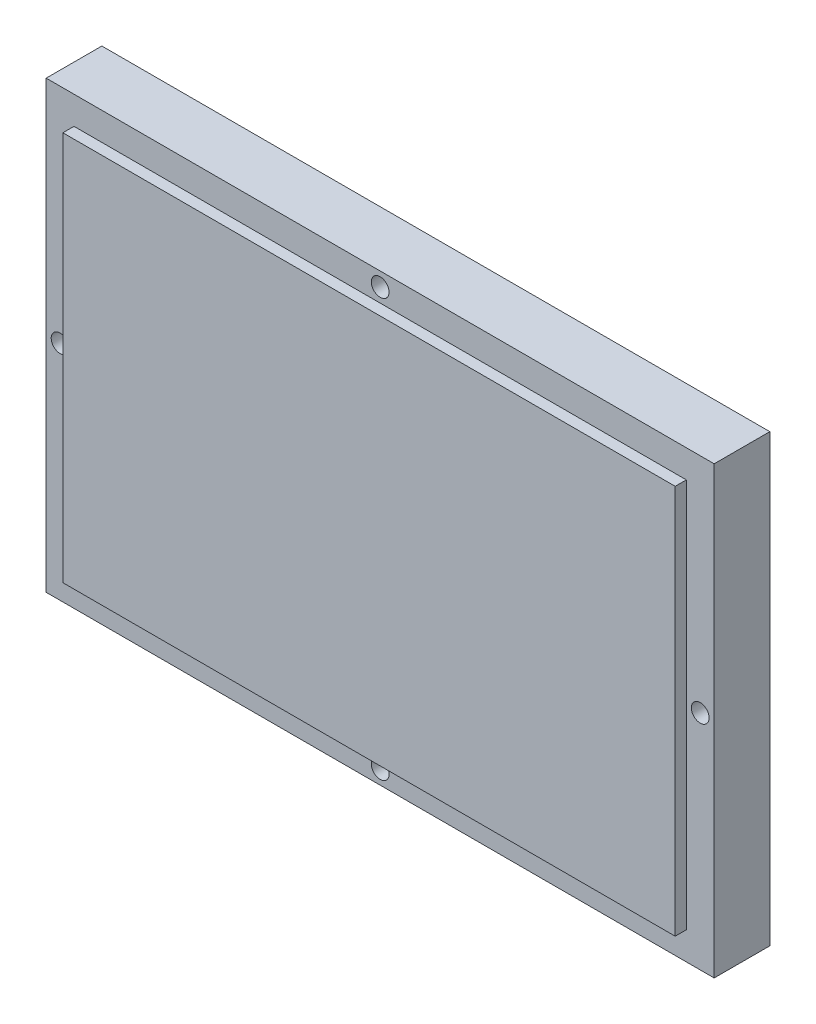
ISO-10303-21;
HEADER;
FILE_DESCRIPTION(('STEP AP214'),'2;1');
FILE_NAME('part.step','',(''),(''),'','','');
FILE_SCHEMA(('AUTOMOTIVE_DESIGN { 1 0 10303 214 1 1 1 1 }'));
ENDSEC;
DATA;
#1=APPLICATION_CONTEXT('core data for automotive mechanical design processes');
#2=APPLICATION_PROTOCOL_DEFINITION('international standard','automotive_design',2000,#1);
#3=PRODUCT_CONTEXT('',#1,'mechanical');
#4=PRODUCT('Part','Part','',(#3));
#5=PRODUCT_RELATED_PRODUCT_CATEGORY('part','',(#4));
#6=PRODUCT_DEFINITION_FORMATION('','',#4);
#7=PRODUCT_DEFINITION_CONTEXT('part definition',#1,'design');
#8=PRODUCT_DEFINITION('design','',#6,#7);
#9=PRODUCT_DEFINITION_SHAPE('','',#8);
#10=(LENGTH_UNIT() NAMED_UNIT(*) SI_UNIT(.MILLI.,.METRE.));
#11=(NAMED_UNIT(*) PLANE_ANGLE_UNIT() SI_UNIT($,.RADIAN.));
#12=(NAMED_UNIT(*) SI_UNIT($,.STERADIAN.) SOLID_ANGLE_UNIT());
#13=UNCERTAINTY_MEASURE_WITH_UNIT(LENGTH_MEASURE(1.E-05),#10,'distance_accuracy_value','');
#14=(GEOMETRIC_REPRESENTATION_CONTEXT(3) GLOBAL_UNCERTAINTY_ASSIGNED_CONTEXT((#13)) GLOBAL_UNIT_ASSIGNED_CONTEXT((#10,
#11,#12)) REPRESENTATION_CONTEXT('',''));
#15=CARTESIAN_POINT('',(0.,0.,0.));
#16=DIRECTION('',(0.,0.,1.));
#17=DIRECTION('',(1.,0.,0.));
#18=AXIS2_PLACEMENT_3D('',#15,#16,#17);
#19=CARTESIAN_POINT('',(0.,0.,7.62));
#20=DIRECTION('',(1.,0.,0.));
#21=DIRECTION('',(0.,0.,-1.));
#22=AXIS2_PLACEMENT_3D('',#19,#20,#21);
#23=PLANE('',#22);
#24=DIRECTION('',(0.,-1.,0.));
#25=VECTOR('',#24,1.);
#26=CARTESIAN_POINT('',(0.,0.,6.35));
#27=LINE('',#26,#25);
#28=CARTESIAN_POINT('',(0.,50.8,6.35));
#29=VERTEX_POINT('',#28);
#30=CARTESIAN_POINT('',(0.,0.,6.35));
#31=VERTEX_POINT('',#30);
#32=EDGE_CURVE('E140',#29,#31,#27,.T.);
#33=ORIENTED_EDGE('',*,*,#32,.F.);
#34=DIRECTION('',(0.,0.,-1.));
#35=VECTOR('',#34,1.);
#36=CARTESIAN_POINT('',(0.,50.8,7.62));
#37=LINE('',#36,#35);
#38=CARTESIAN_POINT('',(0.,50.8,0.));
#39=VERTEX_POINT('',#38);
#40=EDGE_CURVE('E162',#29,#39,#37,.T.);
#41=ORIENTED_EDGE('',*,*,#40,.T.);
#42=DIRECTION('',(0.,-1.,0.));
#43=VECTOR('',#42,1.);
#44=CARTESIAN_POINT('',(0.,0.,0.));
#45=LINE('',#44,#43);
#46=CARTESIAN_POINT('',(0.,0.,0.));
#47=VERTEX_POINT('',#46);
#48=EDGE_CURVE('E146',#39,#47,#45,.T.);
#49=ORIENTED_EDGE('',*,*,#48,.T.);
#50=DIRECTION('',(0.,0.,-1.));
#51=VECTOR('',#50,1.);
#52=CARTESIAN_POINT('',(0.,0.,7.62));
#53=LINE('',#52,#51);
#54=EDGE_CURVE('E11',#31,#47,#53,.T.);
#55=ORIENTED_EDGE('',*,*,#54,.F.);
#56=EDGE_LOOP('',(#33,#41,#49,#55));
#57=FACE_BOUND('',#56,.T.);
#58=ADVANCED_FACE('F39',(#57),#23,.F.);
#59=CARTESIAN_POINT('',(0.,0.,7.62));
#60=DIRECTION('',(0.,1.,0.));
#61=DIRECTION('',(0.,0.,1.));
#62=AXIS2_PLACEMENT_3D('',#59,#60,#61);
#63=PLANE('',#62);
#64=DIRECTION('',(1.,0.,0.));
#65=VECTOR('',#64,1.);
#66=CARTESIAN_POINT('',(0.,0.,6.35));
#67=LINE('',#66,#65);
#68=CARTESIAN_POINT('',(76.2,0.,6.35));
#69=VERTEX_POINT('',#68);
#70=EDGE_CURVE('E117',#31,#69,#67,.T.);
#71=ORIENTED_EDGE('',*,*,#70,.F.);
#72=ORIENTED_EDGE('',*,*,#54,.T.);
#73=DIRECTION('',(1.,0.,0.));
#74=VECTOR('',#73,1.);
#75=CARTESIAN_POINT('',(0.,0.,0.));
#76=LINE('',#75,#74);
#77=CARTESIAN_POINT('',(76.2,0.,0.));
#78=VERTEX_POINT('',#77);
#79=EDGE_CURVE('E152',#47,#78,#76,.T.);
#80=ORIENTED_EDGE('',*,*,#79,.T.);
#81=DIRECTION('',(0.,0.,-1.));
#82=VECTOR('',#81,1.);
#83=CARTESIAN_POINT('',(76.2,0.,7.62));
#84=LINE('',#83,#82);
#85=EDGE_CURVE('E46',#69,#78,#84,.T.);
#86=ORIENTED_EDGE('',*,*,#85,.F.);
#87=EDGE_LOOP('',(#71,#72,#80,#86));
#88=FACE_BOUND('',#87,.T.);
#89=ADVANCED_FACE('F174',(#88),#63,.F.);
#90=CARTESIAN_POINT('',(76.2,0.,7.62));
#91=DIRECTION('',(-1.,0.,0.));
#92=DIRECTION('',(0.,0.,1.));
#93=AXIS2_PLACEMENT_3D('',#90,#91,#92);
#94=PLANE('',#93);
#95=DIRECTION('',(0.,1.,0.));
#96=VECTOR('',#95,1.);
#97=CARTESIAN_POINT('',(76.2,0.,6.35));
#98=LINE('',#97,#96);
#99=CARTESIAN_POINT('',(76.2,50.8,6.35));
#100=VERTEX_POINT('',#99);
#101=EDGE_CURVE('E52',#69,#100,#98,.T.);
#102=ORIENTED_EDGE('',*,*,#101,.F.);
#103=ORIENTED_EDGE('',*,*,#85,.T.);
#104=DIRECTION('',(0.,1.,0.));
#105=VECTOR('',#104,1.);
#106=CARTESIAN_POINT('',(76.2,0.,0.));
#107=LINE('',#106,#105);
#108=CARTESIAN_POINT('',(76.2,50.8,0.));
#109=VERTEX_POINT('',#108);
#110=EDGE_CURVE('E160',#78,#109,#107,.T.);
#111=ORIENTED_EDGE('',*,*,#110,.T.);
#112=DIRECTION('',(0.,0.,-1.));
#113=VECTOR('',#112,1.);
#114=CARTESIAN_POINT('',(76.2,50.8,7.62));
#115=LINE('',#114,#113);
#116=EDGE_CURVE('E164',#100,#109,#115,.T.);
#117=ORIENTED_EDGE('',*,*,#116,.F.);
#118=EDGE_LOOP('',(#102,#103,#111,#117));
#119=FACE_BOUND('',#118,.T.);
#120=ADVANCED_FACE('F169',(#119),#94,.F.);
#121=CARTESIAN_POINT('',(0.,50.8,7.62));
#122=DIRECTION('',(0.,-1.,0.));
#123=DIRECTION('',(0.,0.,-1.));
#124=AXIS2_PLACEMENT_3D('',#121,#122,#123);
#125=PLANE('',#124);
#126=DIRECTION('',(-1.,0.,0.));
#127=VECTOR('',#126,1.);
#128=CARTESIAN_POINT('',(0.,50.8,6.35));
#129=LINE('',#128,#127);
#130=EDGE_CURVE('E134',#100,#29,#129,.T.);
#131=ORIENTED_EDGE('',*,*,#130,.F.);
#132=ORIENTED_EDGE('',*,*,#116,.T.);
#133=DIRECTION('',(-1.,0.,0.));
#134=VECTOR('',#133,1.);
#135=CARTESIAN_POINT('',(0.,50.8,0.));
#136=LINE('',#135,#134);
#137=EDGE_CURVE('E159',#109,#39,#136,.T.);
#138=ORIENTED_EDGE('',*,*,#137,.T.);
#139=ORIENTED_EDGE('',*,*,#40,.F.);
#140=EDGE_LOOP('',(#131,#132,#138,#139));
#141=FACE_BOUND('',#140,.T.);
#142=ADVANCED_FACE('F185',(#141),#125,.F.);
#143=CARTESIAN_POINT('',(0.,0.,0.));
#144=DIRECTION('',(0.,0.,-1.));
#145=DIRECTION('',(-1.,0.,0.));
#146=AXIS2_PLACEMENT_3D('',#143,#144,#145);
#147=PLANE('',#146);
#148=CARTESIAN_POINT('',(1.5875,25.4,0.));
#149=DIRECTION('',(0.,0.,1.));
#150=DIRECTION('',(1.,0.,0.));
#151=AXIS2_PLACEMENT_3D('',#148,#149,#150);
#152=CIRCLE('',#151,1.016);
#153=CARTESIAN_POINT('',(2.6035,25.4,0.));
#154=VERTEX_POINT('',#153);
#155=EDGE_CURVE('E142',#154,#154,#152,.T.);
#156=ORIENTED_EDGE('',*,*,#155,.T.);
#157=EDGE_LOOP('',(#156));
#158=FACE_BOUND('',#157,.T.);
#159=CARTESIAN_POINT('',(38.1,49.2125,0.));
#160=DIRECTION('',(0.,0.,1.));
#161=DIRECTION('',(1.,0.,0.));
#162=AXIS2_PLACEMENT_3D('',#159,#160,#161);
#163=CIRCLE('',#162,1.016);
#164=CARTESIAN_POINT('',(39.116,49.2125,0.));
#165=VERTEX_POINT('',#164);
#166=EDGE_CURVE('E244',#165,#165,#163,.T.);
#167=ORIENTED_EDGE('',*,*,#166,.T.);
#168=EDGE_LOOP('',(#167));
#169=FACE_BOUND('',#168,.T.);
#170=CARTESIAN_POINT('',(74.6125,25.4,0.));
#171=DIRECTION('',(0.,0.,1.));
#172=DIRECTION('',(1.,0.,0.));
#173=AXIS2_PLACEMENT_3D('',#170,#171,#172);
#174=CIRCLE('',#173,1.016);
#175=CARTESIAN_POINT('',(75.6285,25.4,0.));
#176=VERTEX_POINT('',#175);
#177=EDGE_CURVE('E251',#176,#176,#174,.T.);
#178=ORIENTED_EDGE('',*,*,#177,.T.);
#179=EDGE_LOOP('',(#178));
#180=FACE_BOUND('',#179,.T.);
#181=CARTESIAN_POINT('',(38.1,1.58750000000001,0.));
#182=DIRECTION('',(0.,0.,1.));
#183=DIRECTION('',(1.,0.,0.));
#184=AXIS2_PLACEMENT_3D('',#181,#182,#183);
#185=CIRCLE('',#184,1.016);
#186=CARTESIAN_POINT('',(39.116,1.58750000000001,0.));
#187=VERTEX_POINT('',#186);
#188=EDGE_CURVE('E129',#187,#187,#185,.T.);
#189=ORIENTED_EDGE('',*,*,#188,.T.);
#190=EDGE_LOOP('',(#189));
#191=FACE_BOUND('',#190,.T.);
#192=ORIENTED_EDGE('',*,*,#48,.F.);
#193=ORIENTED_EDGE('',*,*,#137,.F.);
#194=ORIENTED_EDGE('',*,*,#110,.F.);
#195=ORIENTED_EDGE('',*,*,#79,.F.);
#196=EDGE_LOOP('',(#192,#193,#194,#195));
#197=FACE_BOUND('',#196,.T.);
#198=ADVANCED_FACE('F177',(#158,#169,#180,#191,#197),#147,.T.);
#199=CARTESIAN_POINT('',(0.,47.625,6.35));
#200=DIRECTION('',(0.,-1.,0.));
#201=DIRECTION('',(0.,0.,-1.));
#202=AXIS2_PLACEMENT_3D('',#199,#200,#201);
#203=PLANE('',#202);
#204=DIRECTION('',(1.,0.,0.));
#205=VECTOR('',#204,1.);
#206=CARTESIAN_POINT('',(0.,47.625,7.62));
#207=LINE('',#206,#205);
#208=CARTESIAN_POINT('',(3.175,47.625,7.62));
#209=VERTEX_POINT('',#208);
#210=CARTESIAN_POINT('',(73.025,47.625,7.62));
#211=VERTEX_POINT('',#210);
#212=EDGE_CURVE('E61',#209,#211,#207,.T.);
#213=ORIENTED_EDGE('',*,*,#212,.T.);
#214=DIRECTION('',(0.,0.,1.));
#215=VECTOR('',#214,1.);
#216=CARTESIAN_POINT('',(73.025,47.625,6.35));
#217=LINE('',#216,#215);
#218=CARTESIAN_POINT('',(73.025,47.625,6.35));
#219=VERTEX_POINT('',#218);
#220=EDGE_CURVE('E106',#219,#211,#217,.T.);
#221=ORIENTED_EDGE('',*,*,#220,.F.);
#222=DIRECTION('',(1.,0.,0.));
#223=VECTOR('',#222,1.);
#224=CARTESIAN_POINT('',(0.,47.625,6.35));
#225=LINE('',#224,#223);
#226=CARTESIAN_POINT('',(3.175,47.625,6.35));
#227=VERTEX_POINT('',#226);
#228=EDGE_CURVE('E114',#227,#219,#225,.T.);
#229=ORIENTED_EDGE('',*,*,#228,.F.);
#230=DIRECTION('',(0.,0.,1.));
#231=VECTOR('',#230,1.);
#232=CARTESIAN_POINT('',(3.175,47.625,6.35));
#233=LINE('',#232,#231);
#234=EDGE_CURVE('E148',#227,#209,#233,.T.);
#235=ORIENTED_EDGE('',*,*,#234,.T.);
#236=EDGE_LOOP('',(#213,#221,#229,#235));
#237=FACE_BOUND('',#236,.T.);
#238=ADVANCED_FACE('F116',(#237),#203,.F.);
#239=CARTESIAN_POINT('',(3.175,0.,6.35));
#240=DIRECTION('',(1.,0.,0.));
#241=DIRECTION('',(0.,0.,-1.));
#242=AXIS2_PLACEMENT_3D('',#239,#240,#241);
#243=PLANE('',#242);
#244=DIRECTION('',(0.,1.,0.));
#245=VECTOR('',#244,1.);
#246=CARTESIAN_POINT('',(3.175,0.,7.62));
#247=LINE('',#246,#245);
#248=CARTESIAN_POINT('',(3.175,3.17500000000002,7.62));
#249=VERTEX_POINT('',#248);
#250=EDGE_CURVE('E121',#249,#209,#247,.T.);
#251=ORIENTED_EDGE('',*,*,#250,.T.);
#252=ORIENTED_EDGE('',*,*,#234,.F.);
#253=DIRECTION('',(0.,1.,0.));
#254=VECTOR('',#253,1.);
#255=CARTESIAN_POINT('',(3.175,0.,6.35));
#256=LINE('',#255,#254);
#257=CARTESIAN_POINT('',(3.175,3.17500000000002,6.35));
#258=VERTEX_POINT('',#257);
#259=EDGE_CURVE('E125',#258,#227,#256,.T.);
#260=ORIENTED_EDGE('',*,*,#259,.F.);
#261=DIRECTION('',(0.,0.,1.));
#262=VECTOR('',#261,1.);
#263=CARTESIAN_POINT('',(3.175,3.17500000000002,6.35));
#264=LINE('',#263,#262);
#265=EDGE_CURVE('E149',#258,#249,#264,.T.);
#266=ORIENTED_EDGE('',*,*,#265,.T.);
#267=EDGE_LOOP('',(#251,#252,#260,#266));
#268=FACE_BOUND('',#267,.T.);
#269=ADVANCED_FACE('F206',(#268),#243,.F.);
#270=CARTESIAN_POINT('',(0.,3.17500000000002,6.35));
#271=DIRECTION('',(0.,-1.,0.));
#272=DIRECTION('',(0.,0.,-1.));
#273=AXIS2_PLACEMENT_3D('',#270,#271,#272);
#274=PLANE('',#273);
#275=DIRECTION('',(1.,0.,0.));
#276=VECTOR('',#275,1.);
#277=CARTESIAN_POINT('',(0.,3.17500000000002,7.62));
#278=LINE('',#277,#276);
#279=CARTESIAN_POINT('',(73.025,3.17500000000002,7.62));
#280=VERTEX_POINT('',#279);
#281=EDGE_CURVE('E127',#249,#280,#278,.T.);
#282=ORIENTED_EDGE('',*,*,#281,.F.);
#283=ORIENTED_EDGE('',*,*,#265,.F.);
#284=DIRECTION('',(1.,0.,0.));
#285=VECTOR('',#284,1.);
#286=CARTESIAN_POINT('',(0.,3.17500000000002,6.35));
#287=LINE('',#286,#285);
#288=CARTESIAN_POINT('',(73.025,3.17500000000002,6.35));
#289=VERTEX_POINT('',#288);
#290=EDGE_CURVE('E115',#258,#289,#287,.T.);
#291=ORIENTED_EDGE('',*,*,#290,.T.);
#292=DIRECTION('',(0.,0.,1.));
#293=VECTOR('',#292,1.);
#294=CARTESIAN_POINT('',(73.025,3.17500000000002,6.35));
#295=LINE('',#294,#293);
#296=EDGE_CURVE('E107',#289,#280,#295,.T.);
#297=ORIENTED_EDGE('',*,*,#296,.T.);
#298=EDGE_LOOP('',(#282,#283,#291,#297));
#299=FACE_BOUND('',#298,.T.);
#300=ADVANCED_FACE('F207',(#299),#274,.T.);
#301=CARTESIAN_POINT('',(73.025,0.,6.35));
#302=DIRECTION('',(1.,0.,0.));
#303=DIRECTION('',(0.,0.,-1.));
#304=AXIS2_PLACEMENT_3D('',#301,#302,#303);
#305=PLANE('',#304);
#306=DIRECTION('',(0.,1.,0.));
#307=VECTOR('',#306,1.);
#308=CARTESIAN_POINT('',(73.025,0.,7.62));
#309=LINE('',#308,#307);
#310=EDGE_CURVE('E143',#280,#211,#309,.T.);
#311=ORIENTED_EDGE('',*,*,#310,.F.);
#312=ORIENTED_EDGE('',*,*,#296,.F.);
#313=DIRECTION('',(0.,1.,0.));
#314=VECTOR('',#313,1.);
#315=CARTESIAN_POINT('',(73.025,0.,6.35));
#316=LINE('',#315,#314);
#317=EDGE_CURVE('E103',#289,#219,#316,.T.);
#318=ORIENTED_EDGE('',*,*,#317,.T.);
#319=ORIENTED_EDGE('',*,*,#220,.T.);
#320=EDGE_LOOP('',(#311,#312,#318,#319));
#321=FACE_BOUND('',#320,.T.);
#322=ADVANCED_FACE('F104',(#321),#305,.T.);
#323=CARTESIAN_POINT('',(0.,0.,6.35));
#324=DIRECTION('',(0.,0.,1.));
#325=DIRECTION('',(1.,0.,0.));
#326=AXIS2_PLACEMENT_3D('',#323,#324,#325);
#327=PLANE('',#326);
#328=CARTESIAN_POINT('',(1.5875,25.4,6.35));
#329=DIRECTION('',(0.,0.,1.));
#330=DIRECTION('',(1.,0.,0.));
#331=AXIS2_PLACEMENT_3D('',#328,#329,#330);
#332=CIRCLE('',#331,1.016);
#333=CARTESIAN_POINT('',(2.6035,25.4,6.35));
#334=VERTEX_POINT('',#333);
#335=EDGE_CURVE('E238',#334,#334,#332,.T.);
#336=ORIENTED_EDGE('',*,*,#335,.F.);
#337=EDGE_LOOP('',(#336));
#338=FACE_BOUND('',#337,.T.);
#339=CARTESIAN_POINT('',(38.1,49.2125,6.35));
#340=DIRECTION('',(0.,0.,1.));
#341=DIRECTION('',(1.,0.,0.));
#342=AXIS2_PLACEMENT_3D('',#339,#340,#341);
#343=CIRCLE('',#342,1.016);
#344=CARTESIAN_POINT('',(39.116,49.2125,6.35));
#345=VERTEX_POINT('',#344);
#346=EDGE_CURVE('E241',#345,#345,#343,.T.);
#347=ORIENTED_EDGE('',*,*,#346,.F.);
#348=EDGE_LOOP('',(#347));
#349=FACE_BOUND('',#348,.T.);
#350=CARTESIAN_POINT('',(74.6125,25.4,6.35));
#351=DIRECTION('',(0.,0.,1.));
#352=DIRECTION('',(1.,0.,0.));
#353=AXIS2_PLACEMENT_3D('',#350,#351,#352);
#354=CIRCLE('',#353,1.016);
#355=CARTESIAN_POINT('',(75.6285,25.4,6.35));
#356=VERTEX_POINT('',#355);
#357=EDGE_CURVE('E249',#356,#356,#354,.T.);
#358=ORIENTED_EDGE('',*,*,#357,.F.);
#359=EDGE_LOOP('',(#358));
#360=FACE_BOUND('',#359,.T.);
#361=CARTESIAN_POINT('',(38.1,1.58750000000001,6.35));
#362=DIRECTION('',(0.,0.,1.));
#363=DIRECTION('',(1.,0.,0.));
#364=AXIS2_PLACEMENT_3D('',#361,#362,#363);
#365=CIRCLE('',#364,1.016);
#366=CARTESIAN_POINT('',(39.116,1.58750000000001,6.35));
#367=VERTEX_POINT('',#366);
#368=EDGE_CURVE('E254',#367,#367,#365,.T.);
#369=ORIENTED_EDGE('',*,*,#368,.F.);
#370=EDGE_LOOP('',(#369));
#371=FACE_BOUND('',#370,.T.);
#372=ORIENTED_EDGE('',*,*,#228,.T.);
#373=ORIENTED_EDGE('',*,*,#317,.F.);
#374=ORIENTED_EDGE('',*,*,#290,.F.);
#375=ORIENTED_EDGE('',*,*,#259,.T.);
#376=EDGE_LOOP('',(#372,#373,#374,#375));
#377=FACE_BOUND('',#376,.T.);
#378=ORIENTED_EDGE('',*,*,#101,.T.);
#379=ORIENTED_EDGE('',*,*,#130,.T.);
#380=ORIENTED_EDGE('',*,*,#32,.T.);
#381=ORIENTED_EDGE('',*,*,#70,.T.);
#382=EDGE_LOOP('',(#378,#379,#380,#381));
#383=FACE_BOUND('',#382,.T.);
#384=ADVANCED_FACE('F119',(#338,#349,#360,#371,#377,#383),#327,.T.);
#385=CARTESIAN_POINT('',(0.,0.,7.62));
#386=DIRECTION('',(0.,0.,-1.));
#387=DIRECTION('',(-1.,0.,0.));
#388=AXIS2_PLACEMENT_3D('',#385,#386,#387);
#389=PLANE('',#388);
#390=ORIENTED_EDGE('',*,*,#310,.T.);
#391=ORIENTED_EDGE('',*,*,#212,.F.);
#392=ORIENTED_EDGE('',*,*,#250,.F.);
#393=ORIENTED_EDGE('',*,*,#281,.T.);
#394=EDGE_LOOP('',(#390,#391,#392,#393));
#395=FACE_BOUND('',#394,.T.);
#396=ADVANCED_FACE('F200',(#395),#389,.F.);
#397=CARTESIAN_POINT('',(38.1,1.58750000000001,0.));
#398=DIRECTION('',(0.,0.,1.));
#399=DIRECTION('',(1.,0.,0.));
#400=AXIS2_PLACEMENT_3D('',#397,#398,#399);
#401=CYLINDRICAL_SURFACE('',#400,1.016);
#402=ORIENTED_EDGE('',*,*,#188,.F.);
#403=EDGE_LOOP('',(#402));
#404=FACE_BOUND('',#403,.T.);
#405=ORIENTED_EDGE('',*,*,#368,.T.);
#406=EDGE_LOOP('',(#405));
#407=FACE_BOUND('',#406,.T.);
#408=ADVANCED_FACE('F205',(#404,#407),#401,.F.);
#409=CARTESIAN_POINT('',(74.6125,25.4,0.));
#410=DIRECTION('',(0.,0.,1.));
#411=DIRECTION('',(1.,0.,0.));
#412=AXIS2_PLACEMENT_3D('',#409,#410,#411);
#413=CYLINDRICAL_SURFACE('',#412,1.016);
#414=ORIENTED_EDGE('',*,*,#177,.F.);
#415=EDGE_LOOP('',(#414));
#416=FACE_BOUND('',#415,.T.);
#417=ORIENTED_EDGE('',*,*,#357,.T.);
#418=EDGE_LOOP('',(#417));
#419=FACE_BOUND('',#418,.T.);
#420=ADVANCED_FACE('F222',(#416,#419),#413,.F.);
#421=CARTESIAN_POINT('',(38.1,49.2125,0.));
#422=DIRECTION('',(0.,0.,1.));
#423=DIRECTION('',(1.,0.,0.));
#424=AXIS2_PLACEMENT_3D('',#421,#422,#423);
#425=CYLINDRICAL_SURFACE('',#424,1.016);
#426=ORIENTED_EDGE('',*,*,#166,.F.);
#427=EDGE_LOOP('',(#426));
#428=FACE_BOUND('',#427,.T.);
#429=ORIENTED_EDGE('',*,*,#346,.T.);
#430=EDGE_LOOP('',(#429));
#431=FACE_BOUND('',#430,.T.);
#432=ADVANCED_FACE('F223',(#428,#431),#425,.F.);
#433=CARTESIAN_POINT('',(1.5875,25.4,0.));
#434=DIRECTION('',(0.,0.,1.));
#435=DIRECTION('',(1.,0.,0.));
#436=AXIS2_PLACEMENT_3D('',#433,#434,#435);
#437=CYLINDRICAL_SURFACE('',#436,1.016);
#438=ORIENTED_EDGE('',*,*,#155,.F.);
#439=EDGE_LOOP('',(#438));
#440=FACE_BOUND('',#439,.T.);
#441=ORIENTED_EDGE('',*,*,#335,.T.);
#442=EDGE_LOOP('',(#441));
#443=FACE_BOUND('',#442,.T.);
#444=ADVANCED_FACE('F228',(#440,#443),#437,.F.);
#445=CLOSED_SHELL('',(#58,#89,#120,#142,#198,#238,#269,#300,#322,#384,#396,#408,#420,#432,#444));
#446=MANIFOLD_SOLID_BREP('B2',#445);
#447=ADVANCED_BREP_SHAPE_REPRESENTATION('',(#18,#446),#14);
#448=SHAPE_DEFINITION_REPRESENTATION(#9,#447);
ENDSEC;
END-ISO-10303-21;
